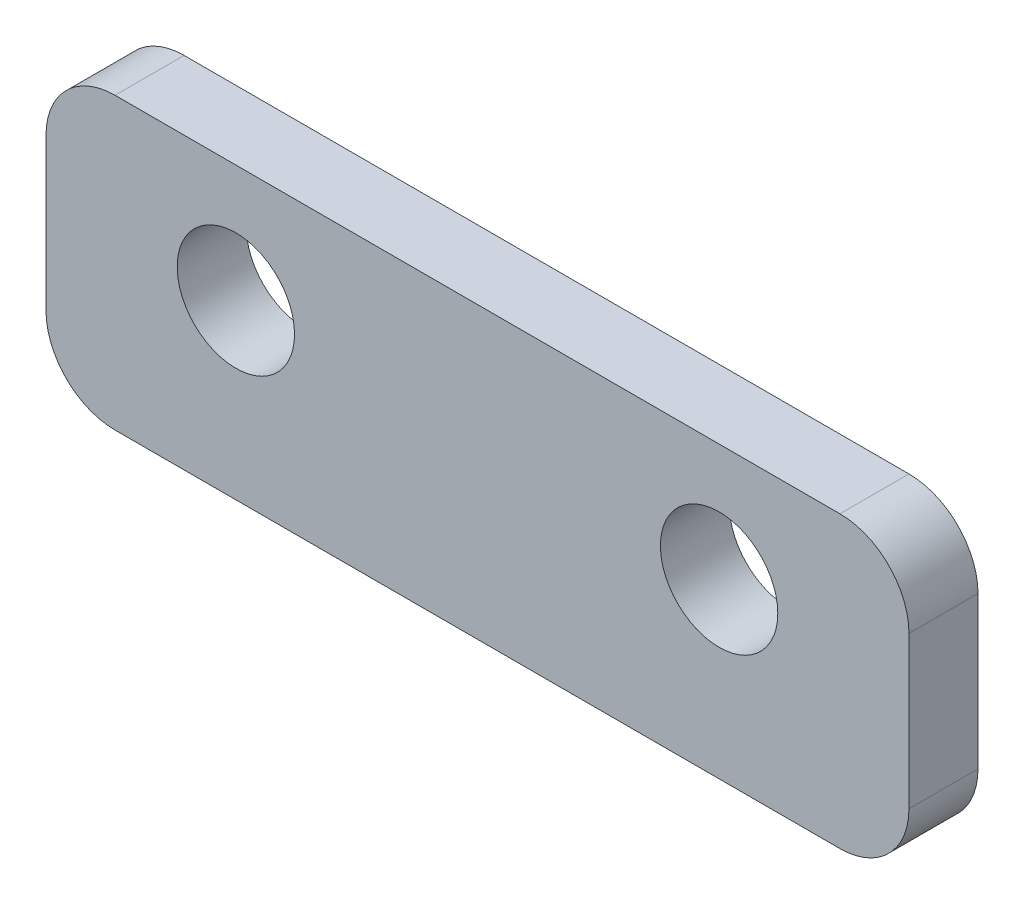
ISO-10303-21;
HEADER;
FILE_DESCRIPTION(('STEP AP214'),'2;1');
FILE_NAME('part.step','',(''),(''),'','','');
FILE_SCHEMA(('AUTOMOTIVE_DESIGN { 1 0 10303 214 1 1 1 1 }'));
ENDSEC;
DATA;
#1=APPLICATION_CONTEXT('core data for automotive mechanical design processes');
#2=APPLICATION_PROTOCOL_DEFINITION('international standard','automotive_design',2000,#1);
#3=PRODUCT_CONTEXT('',#1,'mechanical');
#4=PRODUCT('Part','Part','',(#3));
#5=PRODUCT_RELATED_PRODUCT_CATEGORY('part','',(#4));
#6=PRODUCT_DEFINITION_FORMATION('','',#4);
#7=PRODUCT_DEFINITION_CONTEXT('part definition',#1,'design');
#8=PRODUCT_DEFINITION('design','',#6,#7);
#9=PRODUCT_DEFINITION_SHAPE('','',#8);
#10=(LENGTH_UNIT() NAMED_UNIT(*) SI_UNIT(.MILLI.,.METRE.));
#11=(NAMED_UNIT(*) PLANE_ANGLE_UNIT() SI_UNIT($,.RADIAN.));
#12=(NAMED_UNIT(*) SI_UNIT($,.STERADIAN.) SOLID_ANGLE_UNIT());
#13=UNCERTAINTY_MEASURE_WITH_UNIT(LENGTH_MEASURE(1.E-05),#10,'distance_accuracy_value','');
#14=(GEOMETRIC_REPRESENTATION_CONTEXT(3) GLOBAL_UNCERTAINTY_ASSIGNED_CONTEXT((#13)) GLOBAL_UNIT_ASSIGNED_CONTEXT((#10,
#11,#12)) REPRESENTATION_CONTEXT('',''));
#15=CARTESIAN_POINT('',(0.,0.,0.));
#16=DIRECTION('',(0.,0.,1.));
#17=DIRECTION('',(1.,0.,0.));
#18=AXIS2_PLACEMENT_3D('',#15,#16,#17);
#19=CARTESIAN_POINT('',(12.5,-5.,2.));
#20=DIRECTION('',(-1.,0.,0.));
#21=DIRECTION('',(0.,0.,1.));
#22=AXIS2_PLACEMENT_3D('',#19,#20,#21);
#23=PLANE('',#22);
#24=DIRECTION('',(0.,1.,0.));
#25=VECTOR('',#24,1.);
#26=CARTESIAN_POINT('',(12.5,-5.,2.));
#27=LINE('',#26,#25);
#28=CARTESIAN_POINT('',(12.5,-3.,2.));
#29=VERTEX_POINT('',#28);
#30=CARTESIAN_POINT('',(12.5,1.4,2.));
#31=VERTEX_POINT('',#30);
#32=EDGE_CURVE('E120',#29,#31,#27,.T.);
#33=ORIENTED_EDGE('',*,*,#32,.F.);
#34=DIRECTION('',(0.,0.,-1.));
#35=VECTOR('',#34,1.);
#36=CARTESIAN_POINT('',(12.5,-3.,2.));
#37=LINE('',#36,#35);
#38=CARTESIAN_POINT('',(12.5,-3.,0.));
#39=VERTEX_POINT('',#38);
#40=EDGE_CURVE('E105',#29,#39,#37,.T.);
#41=ORIENTED_EDGE('',*,*,#40,.T.);
#42=DIRECTION('',(0.,1.,0.));
#43=VECTOR('',#42,1.);
#44=CARTESIAN_POINT('',(12.5,-5.,0.));
#45=LINE('',#44,#43);
#46=CARTESIAN_POINT('',(12.5,1.4,0.));
#47=VERTEX_POINT('',#46);
#48=EDGE_CURVE('E117',#39,#47,#45,.T.);
#49=ORIENTED_EDGE('',*,*,#48,.T.);
#50=DIRECTION('',(0.,0.,-1.));
#51=VECTOR('',#50,1.);
#52=CARTESIAN_POINT('',(12.5,1.4,2.));
#53=LINE('',#52,#51);
#54=EDGE_CURVE('E122',#47,#31,#53,.F.);
#55=ORIENTED_EDGE('',*,*,#54,.T.);
#56=EDGE_LOOP('',(#33,#41,#49,#55));
#57=FACE_BOUND('',#56,.T.);
#58=ADVANCED_FACE('F35',(#57),#23,.F.);
#59=CARTESIAN_POINT('',(-12.5,-5.,2.));
#60=DIRECTION('',(1.,0.,0.));
#61=DIRECTION('',(0.,0.,-1.));
#62=AXIS2_PLACEMENT_3D('',#59,#60,#61);
#63=PLANE('',#62);
#64=DIRECTION('',(0.,-1.,0.));
#65=VECTOR('',#64,1.);
#66=CARTESIAN_POINT('',(-12.5,-5.,0.));
#67=LINE('',#66,#65);
#68=CARTESIAN_POINT('',(-12.5,1.4,0.));
#69=VERTEX_POINT('',#68);
#70=CARTESIAN_POINT('',(-12.5,-3.,0.));
#71=VERTEX_POINT('',#70);
#72=EDGE_CURVE('E127',#69,#71,#67,.T.);
#73=ORIENTED_EDGE('',*,*,#72,.T.);
#74=DIRECTION('',(0.,0.,-1.));
#75=VECTOR('',#74,1.);
#76=CARTESIAN_POINT('',(-12.5,-3.,2.));
#77=LINE('',#76,#75);
#78=CARTESIAN_POINT('',(-12.5,-3.,2.));
#79=VERTEX_POINT('',#78);
#80=EDGE_CURVE('E50',#71,#79,#77,.F.);
#81=ORIENTED_EDGE('',*,*,#80,.T.);
#82=DIRECTION('',(0.,-1.,0.));
#83=VECTOR('',#82,1.);
#84=CARTESIAN_POINT('',(-12.5,-5.,2.));
#85=LINE('',#84,#83);
#86=CARTESIAN_POINT('',(-12.5,1.4,2.));
#87=VERTEX_POINT('',#86);
#88=EDGE_CURVE('E181',#87,#79,#85,.T.);
#89=ORIENTED_EDGE('',*,*,#88,.F.);
#90=DIRECTION('',(0.,0.,1.));
#91=VECTOR('',#90,1.);
#92=CARTESIAN_POINT('',(-12.5,1.4,2.));
#93=LINE('',#92,#91);
#94=EDGE_CURVE('E155',#87,#69,#93,.F.);
#95=ORIENTED_EDGE('',*,*,#94,.T.);
#96=EDGE_LOOP('',(#73,#81,#89,#95));
#97=FACE_BOUND('',#96,.T.);
#98=ADVANCED_FACE('F191',(#97),#63,.F.);
#99=CARTESIAN_POINT('',(-12.5,-5.,2.));
#100=DIRECTION('',(0.,1.,0.));
#101=DIRECTION('',(0.,0.,1.));
#102=AXIS2_PLACEMENT_3D('',#99,#100,#101);
#103=PLANE('',#102);
#104=DIRECTION('',(1.,0.,0.));
#105=VECTOR('',#104,1.);
#106=CARTESIAN_POINT('',(-12.5,-5.,0.));
#107=LINE('',#106,#105);
#108=CARTESIAN_POINT('',(-10.5,-5.,0.));
#109=VERTEX_POINT('',#108);
#110=CARTESIAN_POINT('',(10.5,-5.,0.));
#111=VERTEX_POINT('',#110);
#112=EDGE_CURVE('E130',#109,#111,#107,.T.);
#113=ORIENTED_EDGE('',*,*,#112,.T.);
#114=DIRECTION('',(0.,0.,-1.));
#115=VECTOR('',#114,1.);
#116=CARTESIAN_POINT('',(10.5,-5.,2.));
#117=LINE('',#116,#115);
#118=CARTESIAN_POINT('',(10.5,-5.,2.));
#119=VERTEX_POINT('',#118);
#120=EDGE_CURVE('E106',#111,#119,#117,.F.);
#121=ORIENTED_EDGE('',*,*,#120,.T.);
#122=DIRECTION('',(1.,0.,0.));
#123=VECTOR('',#122,1.);
#124=CARTESIAN_POINT('',(-12.5,-5.,2.));
#125=LINE('',#124,#123);
#126=CARTESIAN_POINT('',(-10.5,-5.,2.));
#127=VERTEX_POINT('',#126);
#128=EDGE_CURVE('E136',#127,#119,#125,.T.);
#129=ORIENTED_EDGE('',*,*,#128,.F.);
#130=DIRECTION('',(0.,0.,-1.));
#131=VECTOR('',#130,1.);
#132=CARTESIAN_POINT('',(-10.5,-5.,2.));
#133=LINE('',#132,#131);
#134=EDGE_CURVE('E111',#127,#109,#133,.T.);
#135=ORIENTED_EDGE('',*,*,#134,.T.);
#136=EDGE_LOOP('',(#113,#121,#129,#135));
#137=FACE_BOUND('',#136,.T.);
#138=ADVANCED_FACE('F188',(#137),#103,.F.);
#139=CARTESIAN_POINT('',(0.,0.,2.));
#140=DIRECTION('',(0.,0.,-1.));
#141=DIRECTION('',(-1.,0.,0.));
#142=AXIS2_PLACEMENT_3D('',#139,#140,#141);
#143=PLANE('',#142);
#144=CARTESIAN_POINT('',(-7.,0.,2.));
#145=DIRECTION('',(0.,0.,1.));
#146=DIRECTION('',(1.,0.,0.));
#147=AXIS2_PLACEMENT_3D('',#144,#145,#146);
#148=CIRCLE('',#147,1.7);
#149=CARTESIAN_POINT('',(-5.3,0.,2.));
#150=VERTEX_POINT('',#149);
#151=EDGE_CURVE('E171',#150,#150,#148,.T.);
#152=ORIENTED_EDGE('',*,*,#151,.F.);
#153=EDGE_LOOP('',(#152));
#154=FACE_BOUND('',#153,.T.);
#155=CARTESIAN_POINT('',(7.,0.,2.));
#156=DIRECTION('',(0.,0.,1.));
#157=DIRECTION('',(1.,0.,0.));
#158=AXIS2_PLACEMENT_3D('',#155,#156,#157);
#159=CIRCLE('',#158,1.7);
#160=CARTESIAN_POINT('',(8.7,0.,2.));
#161=VERTEX_POINT('',#160);
#162=EDGE_CURVE('E133',#161,#161,#159,.T.);
#163=ORIENTED_EDGE('',*,*,#162,.F.);
#164=EDGE_LOOP('',(#163));
#165=FACE_BOUND('',#164,.T.);
#166=ORIENTED_EDGE('',*,*,#128,.T.);
#167=CARTESIAN_POINT('',(10.5,-3.,2.));
#168=DIRECTION('',(0.,0.,-1.));
#169=DIRECTION('',(-1.,0.,0.));
#170=AXIS2_PLACEMENT_3D('',#167,#168,#169);
#171=CIRCLE('',#170,2.);
#172=EDGE_CURVE('E153',#119,#29,#171,.F.);
#173=ORIENTED_EDGE('',*,*,#172,.T.);
#174=ORIENTED_EDGE('',*,*,#32,.T.);
#175=CARTESIAN_POINT('',(10.5,1.4,2.));
#176=DIRECTION('',(0.,0.,-1.));
#177=DIRECTION('',(-1.,0.,0.));
#178=AXIS2_PLACEMENT_3D('',#175,#176,#177);
#179=CIRCLE('',#178,2.);
#180=CARTESIAN_POINT('',(10.5,3.4,2.));
#181=VERTEX_POINT('',#180);
#182=EDGE_CURVE('E148',#31,#181,#179,.F.);
#183=ORIENTED_EDGE('',*,*,#182,.T.);
#184=DIRECTION('',(1.,0.,0.));
#185=VECTOR('',#184,1.);
#186=CARTESIAN_POINT('',(12.5,3.4,2.));
#187=LINE('',#186,#185);
#188=CARTESIAN_POINT('',(-10.5,3.4,2.));
#189=VERTEX_POINT('',#188);
#190=EDGE_CURVE('E165',#189,#181,#187,.T.);
#191=ORIENTED_EDGE('',*,*,#190,.F.);
#192=CARTESIAN_POINT('',(-10.5,1.4,2.));
#193=DIRECTION('',(0.,0.,-1.));
#194=DIRECTION('',(-1.,0.,0.));
#195=AXIS2_PLACEMENT_3D('',#192,#193,#194);
#196=CIRCLE('',#195,2.);
#197=EDGE_CURVE('E57',#189,#87,#196,.F.);
#198=ORIENTED_EDGE('',*,*,#197,.T.);
#199=ORIENTED_EDGE('',*,*,#88,.T.);
#200=CARTESIAN_POINT('',(-10.5,-3.,2.));
#201=DIRECTION('',(0.,0.,-1.));
#202=DIRECTION('',(-1.,0.,0.));
#203=AXIS2_PLACEMENT_3D('',#200,#201,#202);
#204=CIRCLE('',#203,2.);
#205=EDGE_CURVE('E151',#79,#127,#204,.F.);
#206=ORIENTED_EDGE('',*,*,#205,.T.);
#207=EDGE_LOOP('',(#166,#173,#174,#183,#191,#198,#199,#206));
#208=FACE_BOUND('',#207,.T.);
#209=ADVANCED_FACE('F185',(#154,#165,#208),#143,.F.);
#210=CARTESIAN_POINT('',(0.,0.,0.));
#211=DIRECTION('',(0.,0.,-1.));
#212=DIRECTION('',(-1.,0.,0.));
#213=AXIS2_PLACEMENT_3D('',#210,#211,#212);
#214=PLANE('',#213);
#215=ORIENTED_EDGE('',*,*,#48,.F.);
#216=CARTESIAN_POINT('',(10.5,-3.,0.));
#217=DIRECTION('',(0.,0.,-1.));
#218=DIRECTION('',(-1.,0.,0.));
#219=AXIS2_PLACEMENT_3D('',#216,#217,#218);
#220=CIRCLE('',#219,2.);
#221=EDGE_CURVE('E101',#39,#111,#220,.T.);
#222=ORIENTED_EDGE('',*,*,#221,.T.);
#223=ORIENTED_EDGE('',*,*,#112,.F.);
#224=CARTESIAN_POINT('',(-10.5,-3.,0.));
#225=DIRECTION('',(0.,0.,-1.));
#226=DIRECTION('',(-1.,0.,0.));
#227=AXIS2_PLACEMENT_3D('',#224,#225,#226);
#228=CIRCLE('',#227,2.);
#229=EDGE_CURVE('E112',#109,#71,#228,.T.);
#230=ORIENTED_EDGE('',*,*,#229,.T.);
#231=ORIENTED_EDGE('',*,*,#72,.F.);
#232=CARTESIAN_POINT('',(-10.5,1.4,0.));
#233=DIRECTION('',(0.,0.,-1.));
#234=DIRECTION('',(-1.,0.,0.));
#235=AXIS2_PLACEMENT_3D('',#232,#233,#234);
#236=CIRCLE('',#235,2.);
#237=CARTESIAN_POINT('',(-10.5,3.4,0.));
#238=VERTEX_POINT('',#237);
#239=EDGE_CURVE('E142',#69,#238,#236,.T.);
#240=ORIENTED_EDGE('',*,*,#239,.T.);
#241=DIRECTION('',(-1.,0.,0.));
#242=VECTOR('',#241,1.);
#243=CARTESIAN_POINT('',(12.5,3.4,0.));
#244=LINE('',#243,#242);
#245=CARTESIAN_POINT('',(10.5,3.4,0.));
#246=VERTEX_POINT('',#245);
#247=EDGE_CURVE('E163',#246,#238,#244,.T.);
#248=ORIENTED_EDGE('',*,*,#247,.F.);
#249=CARTESIAN_POINT('',(10.5,1.4,0.));
#250=DIRECTION('',(0.,0.,-1.));
#251=DIRECTION('',(-1.,0.,0.));
#252=AXIS2_PLACEMENT_3D('',#249,#250,#251);
#253=CIRCLE('',#252,2.);
#254=EDGE_CURVE('E121',#246,#47,#253,.T.);
#255=ORIENTED_EDGE('',*,*,#254,.T.);
#256=EDGE_LOOP('',(#215,#222,#223,#230,#231,#240,#248,#255));
#257=FACE_BOUND('',#256,.T.);
#258=CARTESIAN_POINT('',(-7.,0.,0.));
#259=DIRECTION('',(0.,0.,1.));
#260=DIRECTION('',(1.,0.,0.));
#261=AXIS2_PLACEMENT_3D('',#258,#259,#260);
#262=CIRCLE('',#261,1.7);
#263=CARTESIAN_POINT('',(-5.3,0.,0.));
#264=VERTEX_POINT('',#263);
#265=EDGE_CURVE('E176',#264,#264,#262,.T.);
#266=ORIENTED_EDGE('',*,*,#265,.T.);
#267=EDGE_LOOP('',(#266));
#268=FACE_BOUND('',#267,.T.);
#269=CARTESIAN_POINT('',(7.,0.,0.));
#270=DIRECTION('',(0.,0.,1.));
#271=DIRECTION('',(1.,0.,0.));
#272=AXIS2_PLACEMENT_3D('',#269,#270,#271);
#273=CIRCLE('',#272,1.7);
#274=CARTESIAN_POINT('',(8.7,0.,0.));
#275=VERTEX_POINT('',#274);
#276=EDGE_CURVE('E128',#275,#275,#273,.T.);
#277=ORIENTED_EDGE('',*,*,#276,.T.);
#278=EDGE_LOOP('',(#277));
#279=FACE_BOUND('',#278,.T.);
#280=ADVANCED_FACE('F124',(#257,#268,#279),#214,.T.);
#281=CARTESIAN_POINT('',(7.,0.,2.));
#282=DIRECTION('',(0.,0.,1.));
#283=DIRECTION('',(1.,0.,0.));
#284=AXIS2_PLACEMENT_3D('',#281,#282,#283);
#285=CYLINDRICAL_SURFACE('',#284,1.7);
#286=ORIENTED_EDGE('',*,*,#276,.F.);
#287=EDGE_LOOP('',(#286));
#288=FACE_BOUND('',#287,.T.);
#289=ORIENTED_EDGE('',*,*,#162,.T.);
#290=EDGE_LOOP('',(#289));
#291=FACE_BOUND('',#290,.T.);
#292=ADVANCED_FACE('F247',(#288,#291),#285,.F.);
#293=CARTESIAN_POINT('',(-7.,0.,2.));
#294=DIRECTION('',(0.,0.,1.));
#295=DIRECTION('',(1.,0.,0.));
#296=AXIS2_PLACEMENT_3D('',#293,#294,#295);
#297=CYLINDRICAL_SURFACE('',#296,1.7);
#298=ORIENTED_EDGE('',*,*,#265,.F.);
#299=EDGE_LOOP('',(#298));
#300=FACE_BOUND('',#299,.T.);
#301=ORIENTED_EDGE('',*,*,#151,.T.);
#302=EDGE_LOOP('',(#301));
#303=FACE_BOUND('',#302,.T.);
#304=ADVANCED_FACE('F238',(#300,#303),#297,.F.);
#305=CARTESIAN_POINT('',(0.,3.4,0.));
#306=DIRECTION('',(0.,-1.,0.));
#307=DIRECTION('',(0.,0.,-1.));
#308=AXIS2_PLACEMENT_3D('',#305,#306,#307);
#309=PLANE('',#308);
#310=ORIENTED_EDGE('',*,*,#247,.T.);
#311=DIRECTION('',(0.,0.,1.));
#312=VECTOR('',#311,1.);
#313=CARTESIAN_POINT('',(-10.5,3.4,0.));
#314=LINE('',#313,#312);
#315=EDGE_CURVE('E11',#238,#189,#314,.T.);
#316=ORIENTED_EDGE('',*,*,#315,.T.);
#317=ORIENTED_EDGE('',*,*,#190,.T.);
#318=DIRECTION('',(0.,0.,-1.));
#319=VECTOR('',#318,1.);
#320=CARTESIAN_POINT('',(10.5,3.4,0.));
#321=LINE('',#320,#319);
#322=EDGE_CURVE('E43',#181,#246,#321,.T.);
#323=ORIENTED_EDGE('',*,*,#322,.T.);
#324=EDGE_LOOP('',(#310,#316,#317,#323));
#325=FACE_BOUND('',#324,.T.);
#326=ADVANCED_FACE('F162',(#325),#309,.F.);
#327=CARTESIAN_POINT('',(10.5,-3.,2.));
#328=DIRECTION('',(0.,0.,-1.));
#329=DIRECTION('',(-1.,0.,0.));
#330=AXIS2_PLACEMENT_3D('',#327,#328,#329);
#331=CYLINDRICAL_SURFACE('',#330,2.);
#332=ORIENTED_EDGE('',*,*,#172,.F.);
#333=ORIENTED_EDGE('',*,*,#120,.F.);
#334=ORIENTED_EDGE('',*,*,#221,.F.);
#335=ORIENTED_EDGE('',*,*,#40,.F.);
#336=EDGE_LOOP('',(#332,#333,#334,#335));
#337=FACE_BOUND('',#336,.T.);
#338=ADVANCED_FACE('F104',(#337),#331,.T.);
#339=CARTESIAN_POINT('',(-10.5,-3.,2.));
#340=DIRECTION('',(0.,0.,-1.));
#341=DIRECTION('',(-1.,0.,0.));
#342=AXIS2_PLACEMENT_3D('',#339,#340,#341);
#343=CYLINDRICAL_SURFACE('',#342,2.);
#344=ORIENTED_EDGE('',*,*,#205,.F.);
#345=ORIENTED_EDGE('',*,*,#80,.F.);
#346=ORIENTED_EDGE('',*,*,#229,.F.);
#347=ORIENTED_EDGE('',*,*,#134,.F.);
#348=EDGE_LOOP('',(#344,#345,#346,#347));
#349=FACE_BOUND('',#348,.T.);
#350=ADVANCED_FACE('F190',(#349),#343,.T.);
#351=CARTESIAN_POINT('',(-10.5,1.4,0.));
#352=DIRECTION('',(0.,0.,1.));
#353=DIRECTION('',(1.,0.,0.));
#354=AXIS2_PLACEMENT_3D('',#351,#352,#353);
#355=CYLINDRICAL_SURFACE('',#354,2.);
#356=ORIENTED_EDGE('',*,*,#239,.F.);
#357=ORIENTED_EDGE('',*,*,#94,.F.);
#358=ORIENTED_EDGE('',*,*,#197,.F.);
#359=ORIENTED_EDGE('',*,*,#315,.F.);
#360=EDGE_LOOP('',(#356,#357,#358,#359));
#361=FACE_BOUND('',#360,.T.);
#362=ADVANCED_FACE('F194',(#361),#355,.T.);
#363=CARTESIAN_POINT('',(10.5,1.4,0.));
#364=DIRECTION('',(0.,0.,-1.));
#365=DIRECTION('',(-1.,0.,0.));
#366=AXIS2_PLACEMENT_3D('',#363,#364,#365);
#367=CYLINDRICAL_SURFACE('',#366,2.);
#368=ORIENTED_EDGE('',*,*,#182,.F.);
#369=ORIENTED_EDGE('',*,*,#54,.F.);
#370=ORIENTED_EDGE('',*,*,#254,.F.);
#371=ORIENTED_EDGE('',*,*,#322,.F.);
#372=EDGE_LOOP('',(#368,#369,#370,#371));
#373=FACE_BOUND('',#372,.T.);
#374=ADVANCED_FACE('F37',(#373),#367,.T.);
#375=CLOSED_SHELL('',(#58,#98,#138,#209,#280,#292,#304,#326,#338,#350,#362,#374));
#376=MANIFOLD_SOLID_BREP('B2',#375);
#377=ADVANCED_BREP_SHAPE_REPRESENTATION('',(#18,#376),#14);
#378=SHAPE_DEFINITION_REPRESENTATION(#9,#377);
ENDSEC;
END-ISO-10303-21;
